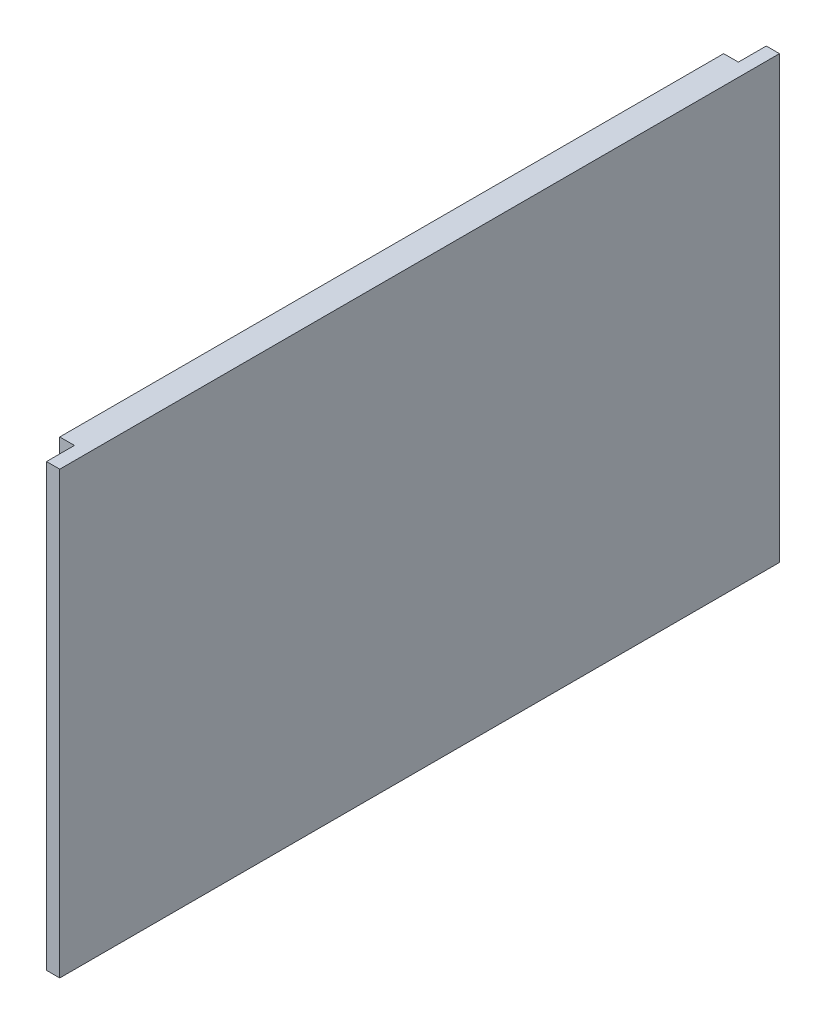
ISO-10303-21;
HEADER;
FILE_DESCRIPTION(('STEP AP214'),'2;1');
FILE_NAME('part.step','',(''),(''),'','','');
FILE_SCHEMA(('AUTOMOTIVE_DESIGN { 1 0 10303 214 1 1 1 1 }'));
ENDSEC;
DATA;
#1=APPLICATION_CONTEXT('core data for automotive mechanical design processes');
#2=APPLICATION_PROTOCOL_DEFINITION('international standard','automotive_design',2000,#1);
#3=PRODUCT_CONTEXT('',#1,'mechanical');
#4=PRODUCT('Part','Part','',(#3));
#5=PRODUCT_RELATED_PRODUCT_CATEGORY('part','',(#4));
#6=PRODUCT_DEFINITION_FORMATION('','',#4);
#7=PRODUCT_DEFINITION_CONTEXT('part definition',#1,'design');
#8=PRODUCT_DEFINITION('design','',#6,#7);
#9=PRODUCT_DEFINITION_SHAPE('','',#8);
#10=(LENGTH_UNIT() NAMED_UNIT(*) SI_UNIT(.MILLI.,.METRE.));
#11=(NAMED_UNIT(*) PLANE_ANGLE_UNIT() SI_UNIT($,.RADIAN.));
#12=(NAMED_UNIT(*) SI_UNIT($,.STERADIAN.) SOLID_ANGLE_UNIT());
#13=UNCERTAINTY_MEASURE_WITH_UNIT(LENGTH_MEASURE(1.E-05),#10,'distance_accuracy_value','');
#14=(GEOMETRIC_REPRESENTATION_CONTEXT(3) GLOBAL_UNCERTAINTY_ASSIGNED_CONTEXT((#13)) GLOBAL_UNIT_ASSIGNED_CONTEXT((#10,
#11,#12)) REPRESENTATION_CONTEXT('',''));
#15=CARTESIAN_POINT('',(0.,0.,0.));
#16=DIRECTION('',(0.,0.,1.));
#17=DIRECTION('',(1.,0.,0.));
#18=AXIS2_PLACEMENT_3D('',#15,#16,#17);
#19=CARTESIAN_POINT('',(19.,0.,-490.));
#20=DIRECTION('',(0.,0.,1.));
#21=DIRECTION('',(1.,0.,0.));
#22=AXIS2_PLACEMENT_3D('',#19,#20,#21);
#23=PLANE('',#22);
#24=DIRECTION('',(0.,-1.,0.));
#25=VECTOR('',#24,1.);
#26=CARTESIAN_POINT('',(10.,300.,-490.));
#27=LINE('',#26,#25);
#28=CARTESIAN_POINT('',(10.,300.,-490.));
#29=VERTEX_POINT('',#28);
#30=CARTESIAN_POINT('',(10.,0.,-490.));
#31=VERTEX_POINT('',#30);
#32=EDGE_CURVE('E97',#29,#31,#27,.T.);
#33=ORIENTED_EDGE('',*,*,#32,.F.);
#34=DIRECTION('',(-1.,0.,0.));
#35=VECTOR('',#34,1.);
#36=CARTESIAN_POINT('',(19.,300.,-490.));
#37=LINE('',#36,#35);
#38=CARTESIAN_POINT('',(19.,300.,-490.));
#39=VERTEX_POINT('',#38);
#40=EDGE_CURVE('E118',#39,#29,#37,.T.);
#41=ORIENTED_EDGE('',*,*,#40,.F.);
#42=DIRECTION('',(0.,1.,0.));
#43=VECTOR('',#42,1.);
#44=CARTESIAN_POINT('',(19.,0.,-490.));
#45=LINE('',#44,#43);
#46=CARTESIAN_POINT('',(19.,0.,-490.));
#47=VERTEX_POINT('',#46);
#48=EDGE_CURVE('E117',#47,#39,#45,.T.);
#49=ORIENTED_EDGE('',*,*,#48,.F.);
#50=DIRECTION('',(-1.,0.,0.));
#51=VECTOR('',#50,1.);
#52=CARTESIAN_POINT('',(19.,0.,-490.));
#53=LINE('',#52,#51);
#54=EDGE_CURVE('E40',#47,#31,#53,.T.);
#55=ORIENTED_EDGE('',*,*,#54,.T.);
#56=EDGE_LOOP('',(#33,#41,#49,#55));
#57=FACE_BOUND('',#56,.T.);
#58=ADVANCED_FACE('F32',(#57),#23,.F.);
#59=CARTESIAN_POINT('',(0.,0.,0.));
#60=DIRECTION('',(-1.,0.,0.));
#61=DIRECTION('',(0.,0.,1.));
#62=AXIS2_PLACEMENT_3D('',#59,#60,#61);
#63=PLANE('',#62);
#64=DIRECTION('',(0.,1.,0.));
#65=VECTOR('',#64,1.);
#66=CARTESIAN_POINT('',(0.,300.,-471.));
#67=LINE('',#66,#65);
#68=CARTESIAN_POINT('',(0.,0.,-471.));
#69=VERTEX_POINT('',#68);
#70=CARTESIAN_POINT('',(0.,300.,-471.));
#71=VERTEX_POINT('',#70);
#72=EDGE_CURVE('E108',#69,#71,#67,.T.);
#73=ORIENTED_EDGE('',*,*,#72,.F.);
#74=DIRECTION('',(0.,0.,-1.));
#75=VECTOR('',#74,1.);
#76=CARTESIAN_POINT('',(0.,0.,0.));
#77=LINE('',#76,#75);
#78=CARTESIAN_POINT('',(0.,0.,-19.));
#79=VERTEX_POINT('',#78);
#80=EDGE_CURVE('E127',#79,#69,#77,.T.);
#81=ORIENTED_EDGE('',*,*,#80,.F.);
#82=DIRECTION('',(0.,-1.,0.));
#83=VECTOR('',#82,1.);
#84=CARTESIAN_POINT('',(0.,300.,-19.));
#85=LINE('',#84,#83);
#86=CARTESIAN_POINT('',(0.,300.,-19.));
#87=VERTEX_POINT('',#86);
#88=EDGE_CURVE('E143',#87,#79,#85,.T.);
#89=ORIENTED_EDGE('',*,*,#88,.F.);
#90=DIRECTION('',(0.,0.,1.));
#91=VECTOR('',#90,1.);
#92=CARTESIAN_POINT('',(0.,300.,0.));
#93=LINE('',#92,#91);
#94=EDGE_CURVE('E55',#71,#87,#93,.T.);
#95=ORIENTED_EDGE('',*,*,#94,.F.);
#96=EDGE_LOOP('',(#73,#81,#89,#95));
#97=FACE_BOUND('',#96,.T.);
#98=ADVANCED_FACE('F164',(#97),#63,.T.);
#99=CARTESIAN_POINT('',(19.,0.,0.));
#100=DIRECTION('',(0.,0.,-1.));
#101=DIRECTION('',(-1.,0.,0.));
#102=AXIS2_PLACEMENT_3D('',#99,#100,#101);
#103=PLANE('',#102);
#104=DIRECTION('',(-1.,0.,0.));
#105=VECTOR('',#104,1.);
#106=CARTESIAN_POINT('',(19.,300.,0.));
#107=LINE('',#106,#105);
#108=CARTESIAN_POINT('',(19.,300.,0.));
#109=VERTEX_POINT('',#108);
#110=CARTESIAN_POINT('',(10.,300.,0.));
#111=VERTEX_POINT('',#110);
#112=EDGE_CURVE('E119',#109,#111,#107,.T.);
#113=ORIENTED_EDGE('',*,*,#112,.T.);
#114=DIRECTION('',(0.,1.,0.));
#115=VECTOR('',#114,1.);
#116=CARTESIAN_POINT('',(10.,300.,0.));
#117=LINE('',#116,#115);
#118=CARTESIAN_POINT('',(10.,0.,0.));
#119=VERTEX_POINT('',#118);
#120=EDGE_CURVE('E141',#119,#111,#117,.T.);
#121=ORIENTED_EDGE('',*,*,#120,.F.);
#122=DIRECTION('',(-1.,0.,0.));
#123=VECTOR('',#122,1.);
#124=CARTESIAN_POINT('',(19.,0.,0.));
#125=LINE('',#124,#123);
#126=CARTESIAN_POINT('',(19.,0.,0.));
#127=VERTEX_POINT('',#126);
#128=EDGE_CURVE('E11',#127,#119,#125,.T.);
#129=ORIENTED_EDGE('',*,*,#128,.F.);
#130=DIRECTION('',(0.,-1.,0.));
#131=VECTOR('',#130,1.);
#132=CARTESIAN_POINT('',(19.,0.,0.));
#133=LINE('',#132,#131);
#134=EDGE_CURVE('E126',#109,#127,#133,.T.);
#135=ORIENTED_EDGE('',*,*,#134,.F.);
#136=EDGE_LOOP('',(#113,#121,#129,#135));
#137=FACE_BOUND('',#136,.T.);
#138=ADVANCED_FACE('F34',(#137),#103,.F.);
#139=CARTESIAN_POINT('',(19.,0.,0.));
#140=DIRECTION('',(0.,1.,0.));
#141=DIRECTION('',(0.,0.,1.));
#142=AXIS2_PLACEMENT_3D('',#139,#140,#141);
#143=PLANE('',#142);
#144=ORIENTED_EDGE('',*,*,#80,.T.);
#145=DIRECTION('',(-1.,0.,0.));
#146=VECTOR('',#145,1.);
#147=CARTESIAN_POINT('',(10.,0.,-471.));
#148=LINE('',#147,#146);
#149=CARTESIAN_POINT('',(10.,0.,-471.));
#150=VERTEX_POINT('',#149);
#151=EDGE_CURVE('E115',#150,#69,#148,.T.);
#152=ORIENTED_EDGE('',*,*,#151,.F.);
#153=DIRECTION('',(0.,0.,1.));
#154=VECTOR('',#153,1.);
#155=CARTESIAN_POINT('',(10.,0.,-490.));
#156=LINE('',#155,#154);
#157=EDGE_CURVE('E100',#31,#150,#156,.T.);
#158=ORIENTED_EDGE('',*,*,#157,.F.);
#159=ORIENTED_EDGE('',*,*,#54,.F.);
#160=DIRECTION('',(0.,0.,-1.));
#161=VECTOR('',#160,1.);
#162=CARTESIAN_POINT('',(19.,0.,0.));
#163=LINE('',#162,#161);
#164=EDGE_CURVE('E132',#127,#47,#163,.T.);
#165=ORIENTED_EDGE('',*,*,#164,.F.);
#166=ORIENTED_EDGE('',*,*,#128,.T.);
#167=DIRECTION('',(0.,0.,1.));
#168=VECTOR('',#167,1.);
#169=CARTESIAN_POINT('',(10.,0.,-19.));
#170=LINE('',#169,#168);
#171=CARTESIAN_POINT('',(10.,0.,-19.));
#172=VERTEX_POINT('',#171);
#173=EDGE_CURVE('E136',#172,#119,#170,.T.);
#174=ORIENTED_EDGE('',*,*,#173,.F.);
#175=DIRECTION('',(1.,0.,0.));
#176=VECTOR('',#175,1.);
#177=CARTESIAN_POINT('',(0.,0.,-19.));
#178=LINE('',#177,#176);
#179=EDGE_CURVE('E149',#79,#172,#178,.T.);
#180=ORIENTED_EDGE('',*,*,#179,.F.);
#181=EDGE_LOOP('',(#144,#152,#158,#159,#165,#166,#174,#180));
#182=FACE_BOUND('',#181,.T.);
#183=ADVANCED_FACE('F113',(#182),#143,.F.);
#184=CARTESIAN_POINT('',(19.,300.,0.));
#185=DIRECTION('',(0.,-1.,0.));
#186=DIRECTION('',(0.,0.,-1.));
#187=AXIS2_PLACEMENT_3D('',#184,#185,#186);
#188=PLANE('',#187);
#189=DIRECTION('',(0.,0.,-1.));
#190=VECTOR('',#189,1.);
#191=CARTESIAN_POINT('',(10.,300.,-490.));
#192=LINE('',#191,#190);
#193=CARTESIAN_POINT('',(10.,300.,-471.));
#194=VERTEX_POINT('',#193);
#195=EDGE_CURVE('E103',#194,#29,#192,.T.);
#196=ORIENTED_EDGE('',*,*,#195,.F.);
#197=DIRECTION('',(-1.,0.,0.));
#198=VECTOR('',#197,1.);
#199=CARTESIAN_POINT('',(10.,300.,-471.));
#200=LINE('',#199,#198);
#201=EDGE_CURVE('E144',#194,#71,#200,.T.);
#202=ORIENTED_EDGE('',*,*,#201,.T.);
#203=ORIENTED_EDGE('',*,*,#94,.T.);
#204=DIRECTION('',(-1.,0.,0.));
#205=VECTOR('',#204,1.);
#206=CARTESIAN_POINT('',(0.,300.,-19.));
#207=LINE('',#206,#205);
#208=CARTESIAN_POINT('',(10.,300.,-19.));
#209=VERTEX_POINT('',#208);
#210=EDGE_CURVE('E138',#209,#87,#207,.T.);
#211=ORIENTED_EDGE('',*,*,#210,.F.);
#212=DIRECTION('',(0.,0.,1.));
#213=VECTOR('',#212,1.);
#214=CARTESIAN_POINT('',(10.,300.,-19.));
#215=LINE('',#214,#213);
#216=EDGE_CURVE('E129',#209,#111,#215,.T.);
#217=ORIENTED_EDGE('',*,*,#216,.T.);
#218=ORIENTED_EDGE('',*,*,#112,.F.);
#219=DIRECTION('',(0.,0.,1.));
#220=VECTOR('',#219,1.);
#221=CARTESIAN_POINT('',(19.,300.,0.));
#222=LINE('',#221,#220);
#223=EDGE_CURVE('E124',#39,#109,#222,.T.);
#224=ORIENTED_EDGE('',*,*,#223,.F.);
#225=ORIENTED_EDGE('',*,*,#40,.T.);
#226=EDGE_LOOP('',(#196,#202,#203,#211,#217,#218,#224,#225));
#227=FACE_BOUND('',#226,.T.);
#228=ADVANCED_FACE('F162',(#227),#188,.F.);
#229=CARTESIAN_POINT('',(19.,0.,0.));
#230=DIRECTION('',(-1.,0.,0.));
#231=DIRECTION('',(0.,0.,1.));
#232=AXIS2_PLACEMENT_3D('',#229,#230,#231);
#233=PLANE('',#232);
#234=ORIENTED_EDGE('',*,*,#134,.T.);
#235=ORIENTED_EDGE('',*,*,#164,.T.);
#236=ORIENTED_EDGE('',*,*,#48,.T.);
#237=ORIENTED_EDGE('',*,*,#223,.T.);
#238=EDGE_LOOP('',(#234,#235,#236,#237));
#239=FACE_BOUND('',#238,.T.);
#240=ADVANCED_FACE('F178',(#239),#233,.F.);
#241=CARTESIAN_POINT('',(10.,300.,-19.));
#242=DIRECTION('',(1.,0.,0.));
#243=DIRECTION('',(0.,1.,0.));
#244=AXIS2_PLACEMENT_3D('',#241,#242,#243);
#245=PLANE('',#244);
#246=ORIENTED_EDGE('',*,*,#120,.T.);
#247=ORIENTED_EDGE('',*,*,#216,.F.);
#248=DIRECTION('',(0.,1.,0.));
#249=VECTOR('',#248,1.);
#250=CARTESIAN_POINT('',(10.,300.,-19.));
#251=LINE('',#250,#249);
#252=EDGE_CURVE('E146',#172,#209,#251,.T.);
#253=ORIENTED_EDGE('',*,*,#252,.F.);
#254=ORIENTED_EDGE('',*,*,#173,.T.);
#255=EDGE_LOOP('',(#246,#247,#253,#254));
#256=FACE_BOUND('',#255,.T.);
#257=ADVANCED_FACE('F172',(#256),#245,.F.);
#258=CARTESIAN_POINT('',(0.,0.,-19.));
#259=DIRECTION('',(0.,0.,1.));
#260=DIRECTION('',(1.,0.,0.));
#261=AXIS2_PLACEMENT_3D('',#258,#259,#260);
#262=PLANE('',#261);
#263=ORIENTED_EDGE('',*,*,#88,.T.);
#264=ORIENTED_EDGE('',*,*,#179,.T.);
#265=ORIENTED_EDGE('',*,*,#252,.T.);
#266=ORIENTED_EDGE('',*,*,#210,.T.);
#267=EDGE_LOOP('',(#263,#264,#265,#266));
#268=FACE_BOUND('',#267,.T.);
#269=ADVANCED_FACE('F167',(#268),#262,.T.);
#270=CARTESIAN_POINT('',(10.,300.,-471.));
#271=DIRECTION('',(0.,0.,1.));
#272=DIRECTION('',(0.,-1.,0.));
#273=AXIS2_PLACEMENT_3D('',#270,#271,#272);
#274=PLANE('',#273);
#275=ORIENTED_EDGE('',*,*,#72,.T.);
#276=ORIENTED_EDGE('',*,*,#201,.F.);
#277=DIRECTION('',(0.,1.,0.));
#278=VECTOR('',#277,1.);
#279=CARTESIAN_POINT('',(10.,300.,-471.));
#280=LINE('',#279,#278);
#281=EDGE_CURVE('E47',#150,#194,#280,.T.);
#282=ORIENTED_EDGE('',*,*,#281,.F.);
#283=ORIENTED_EDGE('',*,*,#151,.T.);
#284=EDGE_LOOP('',(#275,#276,#282,#283));
#285=FACE_BOUND('',#284,.T.);
#286=ADVANCED_FACE('F159',(#285),#274,.F.);
#287=CARTESIAN_POINT('',(10.,0.,0.));
#288=DIRECTION('',(-1.,0.,0.));
#289=DIRECTION('',(0.,0.,1.));
#290=AXIS2_PLACEMENT_3D('',#287,#288,#289);
#291=PLANE('',#290);
#292=ORIENTED_EDGE('',*,*,#32,.T.);
#293=ORIENTED_EDGE('',*,*,#157,.T.);
#294=ORIENTED_EDGE('',*,*,#281,.T.);
#295=ORIENTED_EDGE('',*,*,#195,.T.);
#296=EDGE_LOOP('',(#292,#293,#294,#295));
#297=FACE_BOUND('',#296,.T.);
#298=ADVANCED_FACE('F99',(#297),#291,.T.);
#299=CLOSED_SHELL('',(#58,#98,#138,#183,#228,#240,#257,#269,#286,#298));
#300=MANIFOLD_SOLID_BREP('B2',#299);
#301=ADVANCED_BREP_SHAPE_REPRESENTATION('',(#18,#300),#14);
#302=SHAPE_DEFINITION_REPRESENTATION(#9,#301);
ENDSEC;
END-ISO-10303-21;
